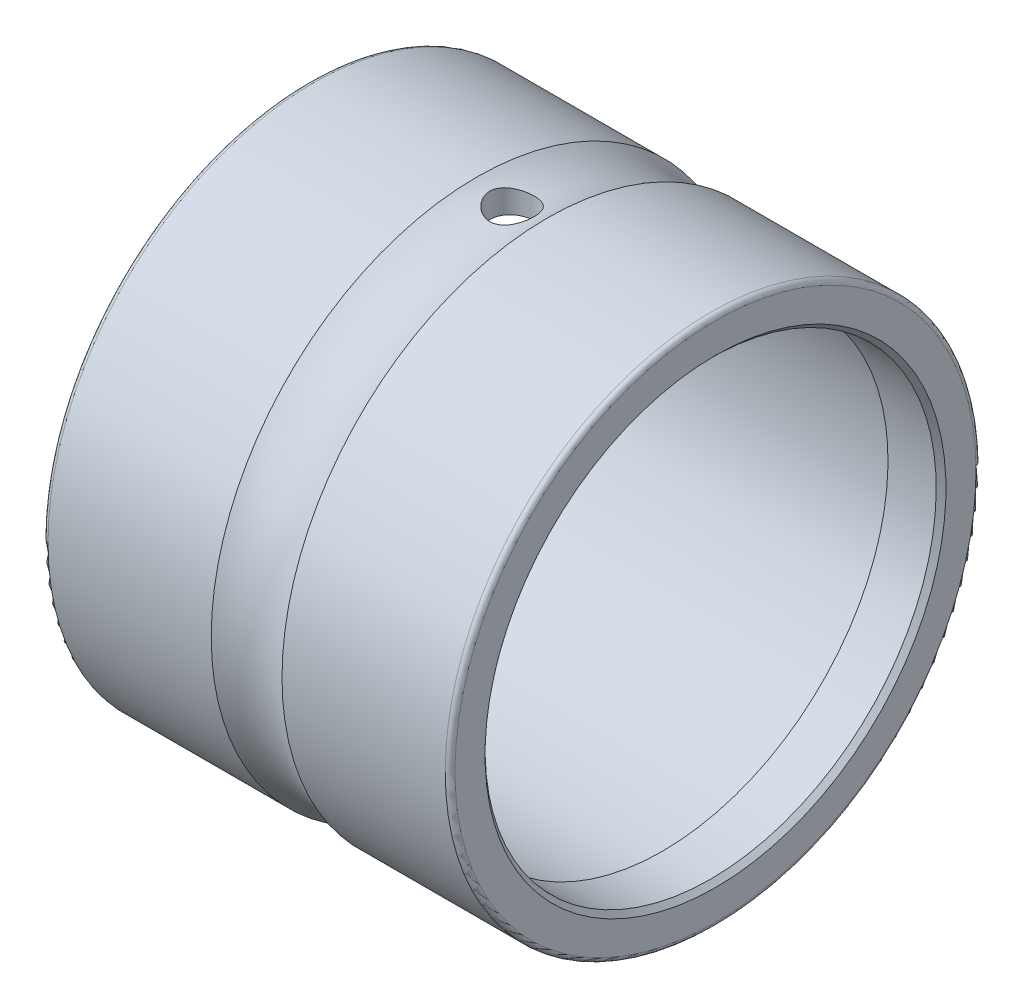
ISO-10303-21;
HEADER;
FILE_DESCRIPTION(('STEP AP214'),'2;1');
FILE_NAME('part.step','',(''),(''),'','','');
FILE_SCHEMA(('AUTOMOTIVE_DESIGN { 1 0 10303 214 1 1 1 1 }'));
ENDSEC;
DATA;
#1=APPLICATION_CONTEXT('core data for automotive mechanical design processes');
#2=APPLICATION_PROTOCOL_DEFINITION('international standard','automotive_design',2000,#1);
#3=PRODUCT_CONTEXT('',#1,'mechanical');
#4=PRODUCT('Part','Part','',(#3));
#5=PRODUCT_RELATED_PRODUCT_CATEGORY('part','',(#4));
#6=PRODUCT_DEFINITION_FORMATION('','',#4);
#7=PRODUCT_DEFINITION_CONTEXT('part definition',#1,'design');
#8=PRODUCT_DEFINITION('design','',#6,#7);
#9=PRODUCT_DEFINITION_SHAPE('','',#8);
#10=(LENGTH_UNIT() NAMED_UNIT(*) SI_UNIT(.MILLI.,.METRE.));
#11=(NAMED_UNIT(*) PLANE_ANGLE_UNIT() SI_UNIT($,.RADIAN.));
#12=(NAMED_UNIT(*) SI_UNIT($,.STERADIAN.) SOLID_ANGLE_UNIT());
#13=UNCERTAINTY_MEASURE_WITH_UNIT(LENGTH_MEASURE(1.E-05),#10,'distance_accuracy_value','');
#14=(GEOMETRIC_REPRESENTATION_CONTEXT(3) GLOBAL_UNCERTAINTY_ASSIGNED_CONTEXT((#13)) GLOBAL_UNIT_ASSIGNED_CONTEXT((#10,
#11,#12)) REPRESENTATION_CONTEXT('',''));
#15=CARTESIAN_POINT('',(0.,0.,0.));
#16=DIRECTION('',(0.,0.,1.));
#17=DIRECTION('',(1.,0.,0.));
#18=AXIS2_PLACEMENT_3D('',#15,#16,#17);
#19=CARTESIAN_POINT('',(0.,0.,0.));
#20=DIRECTION('',(-1.,0.,0.));
#21=DIRECTION('',(0.,-1.,0.));
#22=AXIS2_PLACEMENT_3D('',#19,#20,#21);
#23=TOROIDAL_SURFACE('',#22,18.75,4.24999999999999);
#24=CARTESIAN_POINT('',(-2.,0.,0.));
#25=DIRECTION('',(-1.,0.,0.));
#26=DIRECTION('',(0.,-1.,0.));
#27=AXIS2_PLACEMENT_3D('',#24,#25,#26);
#28=CIRCLE('',#27,15.);
#29=CARTESIAN_POINT('',(-2.,-15.,0.));
#30=VERTEX_POINT('',#29);
#31=EDGE_CURVE('E60',#30,#30,#28,.T.);
#32=ORIENTED_EDGE('',*,*,#31,.F.);
#33=EDGE_LOOP('',(#32));
#34=FACE_BOUND('',#33,.T.);
#35=CARTESIAN_POINT('',(2.,0.,0.));
#36=DIRECTION('',(-1.,0.,0.));
#37=DIRECTION('',(0.,-1.,0.));
#38=AXIS2_PLACEMENT_3D('',#35,#36,#37);
#39=CIRCLE('',#38,15.);
#40=CARTESIAN_POINT('',(2.,-15.,0.));
#41=VERTEX_POINT('',#40);
#42=EDGE_CURVE('E57',#41,#41,#39,.T.);
#43=ORIENTED_EDGE('',*,*,#42,.T.);
#44=EDGE_LOOP('',(#43));
#45=FACE_BOUND('',#44,.T.);
#46=CARTESIAN_POINT('',(-0.791048686627691,14.5420943867216,-0.967855190890034));
#47=CARTESIAN_POINT('',(-0.845709492811952,14.555444961997,-0.923180127931782));
#48=CARTESIAN_POINT('',(-0.89650687943695,14.5692724944397,-0.873930545180668));
#49=CARTESIAN_POINT('',(-0.989151270021171,14.5963724615478,-0.767499728587859));
#50=CARTESIAN_POINT('',(-1.03099916842709,14.6096449515795,-0.710319288329513));
#51=CARTESIAN_POINT('',(-1.10467476487462,14.6341669210217,-0.589256359267895));
#52=CARTESIAN_POINT('',(-1.1364824287829,14.6454123367091,-0.525360805458797));
#53=CARTESIAN_POINT('',(-1.18887078961419,14.6644744579728,-0.392643777702894));
#54=CARTESIAN_POINT('',(-1.20945636636744,14.6722926535568,-0.323824459564263));
#55=CARTESIAN_POINT('',(-1.2379813691787,14.6832508220583,-0.186133153750318));
#56=CARTESIAN_POINT('',(-1.24639359067287,14.6865653728875,-0.117373326334329));
#57=CARTESIAN_POINT('',(-1.25173469951536,14.6886612465337,0.0206518325937706));
#58=CARTESIAN_POINT('',(-1.2486666551591,14.6874437806093,0.0899170241000816));
#59=CARTESIAN_POINT('',(-1.23162452879759,14.6808078706484,0.22339863376863));
#60=CARTESIAN_POINT('',(-1.21819279081154,14.6755984219643,0.287696045622577));
#61=CARTESIAN_POINT('',(-1.18158385672168,14.6618276041373,0.413069280658407));
#62=CARTESIAN_POINT('',(-1.1584051914426,14.6532657296894,0.47414461660726));
#63=CARTESIAN_POINT('',(-1.10227276149858,14.6334296768686,0.593253383396846));
#64=CARTESIAN_POINT('',(-1.06906632234006,14.6220870190916,0.651155926213217));
#65=CARTESIAN_POINT('',(-0.99405167810642,14.5980005110734,0.76077329244967));
#66=CARTESIAN_POINT('',(-0.952240380158707,14.5852561577851,0.812485880394144));
#67=CARTESIAN_POINT('',(-0.858102781622751,14.5588105243837,0.911658787419354));
#68=CARTESIAN_POINT('',(-0.805280482163199,14.5450994788849,0.958646985588648));
#69=CARTESIAN_POINT('',(-0.692258271578246,14.5190006003608,1.04319658497374));
#70=CARTESIAN_POINT('',(-0.632057693796767,14.5066128870933,1.0807571334289));
#71=CARTESIAN_POINT('',(-0.505340621252411,14.4844748603913,1.14552345320767));
#72=CARTESIAN_POINT('',(-0.438785520034044,14.4747422622385,1.17266014245795));
#73=CARTESIAN_POINT('',(-0.301595801632724,14.4591993519161,1.21519150798326));
#74=CARTESIAN_POINT('',(-0.23096323705724,14.4533870846127,1.23059203777365));
#75=CARTESIAN_POINT('',(-0.0920110843501351,14.4466180077876,1.24846114789056));
#76=CARTESIAN_POINT('',(-0.0237931862674781,14.4454003944523,1.25162461453862));
#77=CARTESIAN_POINT('',(0.112182793396952,14.4472365369869,1.24681235243104));
#78=CARTESIAN_POINT('',(0.179940946782644,14.4502896096672,1.23883840534838));
#79=CARTESIAN_POINT('',(0.310823148669988,14.4601486377419,1.21251941368335));
#80=CARTESIAN_POINT('',(0.374026158189612,14.4668306254795,1.19451647394065));
#81=CARTESIAN_POINT('',(0.496504660349915,14.4831633993974,1.14902275013851));
#82=CARTESIAN_POINT('',(0.555779434466402,14.492814726896,1.12153023599354));
#83=CARTESIAN_POINT('',(0.671304179828376,14.5145618758131,1.05660485493537));
#84=CARTESIAN_POINT('',(0.727341445241536,14.5267393581201,1.01882149156785));
#85=CARTESIAN_POINT('',(0.832500615443431,14.5520540117515,0.93486547109749));
#86=CARTESIAN_POINT('',(0.881619880841958,14.565191546472,0.888689627359812));
#87=CARTESIAN_POINT('',(0.974390777463097,14.5918506377829,0.786194972913115));
#88=CARTESIAN_POINT('',(1.01758205464483,14.6053524875484,0.729452905266521));
#89=CARTESIAN_POINT('',(1.09385377917831,14.6304390031347,0.609142896248616));
#90=CARTESIAN_POINT('',(1.12693477895279,14.6420237736884,0.545575328077316));
#91=CARTESIAN_POINT('',(1.18162017670926,14.6617733975852,0.413890427588339));
#92=CARTESIAN_POINT('',(1.20333149328721,14.6699699531239,0.345822520698003));
#93=CARTESIAN_POINT('',(1.23486440821176,14.6820309840607,0.206627253130008));
#94=CARTESIAN_POINT('',(1.24469253234525,14.6858978370765,0.135501593895988));
#95=CARTESIAN_POINT('',(1.2517932720238,14.6886842637897,-0.00291584827152273));
#96=CARTESIAN_POINT('',(1.24982489217191,14.6879029332867,-0.0701636598327384));
#97=CARTESIAN_POINT('',(1.23517423485997,14.6821845878387,-0.203294451635884));
#98=CARTESIAN_POINT('',(1.222492342672,14.6772477223323,-0.269177480869907));
#99=CARTESIAN_POINT('',(1.18722559879251,14.6639262034601,-0.396600771168518));
#100=CARTESIAN_POINT('',(1.16481675242872,14.6556029852933,-0.458196620757425));
#101=CARTESIAN_POINT('',(1.11086825825009,14.6364125130759,-0.576819192446959));
#102=CARTESIAN_POINT('',(1.07932626937366,14.6255446068926,-0.633844738268994));
#103=CARTESIAN_POINT('',(1.00599124132089,14.6017107962678,-0.745090924576703));
#104=CARTESIAN_POINT('',(0.963730230467584,14.5886624334705,-0.79898535693295));
#105=CARTESIAN_POINT('',(0.871026035325545,14.5622998588632,-0.899151694913383));
#106=CARTESIAN_POINT('',(0.82058001216999,14.5489855562254,-0.945420944576796));
#107=CARTESIAN_POINT('',(0.710117710387622,14.5228579942504,-1.03118582903398));
#108=CARTESIAN_POINT('',(0.649765617419236,14.5100967775134,-1.07026673015902));
#109=CARTESIAN_POINT('',(0.522856217971381,14.48723935717,-1.13766398273923));
#110=CARTESIAN_POINT('',(0.45630043352799,14.477142502196,-1.16598296595091));
#111=CARTESIAN_POINT('',(0.320904639044563,14.461076001577,-1.21013929450276));
#112=CARTESIAN_POINT('',(0.252191748861617,14.454992362113,-1.22632335054963));
#113=CARTESIAN_POINT('',(0.112791842537128,14.4472216649406,-1.24689054688727));
#114=CARTESIAN_POINT('',(0.0421057709007099,14.4455325389795,-1.25127923863087));
#115=CARTESIAN_POINT('',(-0.0948324493527313,14.4467189203518,-1.24816797639638));
#116=CARTESIAN_POINT('',(-0.161103374533551,14.4493346637121,-1.24134461705635));
#117=CARTESIAN_POINT('',(-0.291480077495845,14.4583513560121,-1.21734776306887));
#118=CARTESIAN_POINT('',(-0.355585306144595,14.4647532574649,-1.20017166388151));
#119=CARTESIAN_POINT('',(-0.48576977699405,14.4814127880735,-1.15400754304184));
#120=CARTESIAN_POINT('',(-0.551471068915215,14.4919755163614,-1.12406346692639));
#121=CARTESIAN_POINT('',(-0.67645237672481,14.5155599461882,-1.0535967494691));
#122=CARTESIAN_POINT('',(-0.735729085601924,14.5285829047429,-1.01306869634622));
#123=CARTESIAN_POINT('',(-0.791048686627691,14.5420943867216,-0.967855190890034));
#124=B_SPLINE_CURVE_WITH_KNOTS('',3,(#46,#47,#48,#49,#50,#51,#52,#53,#54,#55,#56,#57,#58,#59,
#60,#61,#62,#63,#64,#65,#66,#67,#68,#69,#70,#71,#72,#73,#74,#75,#76,#77,#78,#79,#80,#81,#82,#83,
#84,#85,#86,#87,#88,#89,#90,#91,#92,#93,#94,#95,#96,#97,#98,#99,#100,#101,#102,#103,#104,#105,
#106,#107,#108,#109,#110,#111,#112,#113,#114,#115,#116,#117,#118,#119,#120,#121,#122,#123),
.UNSPECIFIED.,.T.,.F.,(4,2,2,2,2,2,2,2,2,2,2,2,2,2,2,2,2,2,2,2,2,2,2,2,2,2,2,2,2,2,2,2,2,2,2,2,
2,2,4),(0.,0.215285392788078,0.430549259049866,0.646239983371746,0.861836841429606,
1.06881205313994,1.27573195117241,1.47250203203844,1.66930178311845,1.87154567980613,
2.07386239703805,2.28890590773361,2.50396886278875,2.72043347724091,2.93679005722583,
3.14066314054157,3.34450361363285,3.54178252485215,3.73909742186039,3.94422525539414,
4.14943113954977,4.36613095724718,4.58281893240913,4.7974308607874,5.01192487903825,
5.21277273999089,5.41361337849623,5.61096221951837,5.80836169102162,6.01660586550603,
6.22492242182264,6.44292033546301,6.66086490478442,6.87231661809198,7.0836687948437,
7.28272880091213,7.48183890736625,7.69960744173425,7.91748754389677),.UNSPECIFIED.);
#125=CARTESIAN_POINT('',(-0.791048686627691,14.5420943867216,-0.967855190890034));
#126=VERTEX_POINT('',#125);
#127=EDGE_CURVE('E87',#126,#126,#124,.T.);
#128=ORIENTED_EDGE('',*,*,#127,.F.);
#129=EDGE_LOOP('',(#128));
#130=FACE_BOUND('',#129,.T.);
#131=ADVANCED_FACE('F32',(#34,#45,#130),#23,.F.);
#132=CARTESIAN_POINT('',(-11.5,0.,0.));
#133=DIRECTION('',(-1.,0.,0.));
#134=DIRECTION('',(0.,-1.,0.));
#135=AXIS2_PLACEMENT_3D('',#132,#133,#134);
#136=CYLINDRICAL_SURFACE('',#135,13.3);
#137=CARTESIAN_POINT('',(8.5,0.,0.));
#138=DIRECTION('',(-1.,0.,0.));
#139=DIRECTION('',(0.,-1.,0.));
#140=AXIS2_PLACEMENT_3D('',#137,#138,#139);
#141=CIRCLE('',#140,13.3);
#142=CARTESIAN_POINT('',(8.50000000000001,-13.3,0.));
#143=VERTEX_POINT('',#142);
#144=EDGE_CURVE('E81',#143,#143,#141,.T.);
#145=ORIENTED_EDGE('',*,*,#144,.F.);
#146=EDGE_LOOP('',(#145));
#147=FACE_BOUND('',#146,.T.);
#148=CARTESIAN_POINT('',(-8.5,0.,0.));
#149=DIRECTION('',(-1.,0.,0.));
#150=DIRECTION('',(0.,-1.,0.));
#151=AXIS2_PLACEMENT_3D('',#148,#149,#150);
#152=CIRCLE('',#151,13.3);
#153=CARTESIAN_POINT('',(-8.5,-13.3,0.));
#154=VERTEX_POINT('',#153);
#155=EDGE_CURVE('E78',#154,#154,#152,.T.);
#156=ORIENTED_EDGE('',*,*,#155,.T.);
#157=EDGE_LOOP('',(#156));
#158=FACE_BOUND('',#157,.T.);
#159=CARTESIAN_POINT('',(0.,13.2411291059335,-1.25));
#160=CARTESIAN_POINT('',(0.0700464875616936,13.241129880761,-1.24999695558279));
#161=CARTESIAN_POINT('',(0.140139814080811,13.2416909198872,-1.24409236611119));
#162=CARTESIAN_POINT('',(0.27838462201001,13.2438742566758,-1.2206261399049));
#163=CARTESIAN_POINT('',(0.346533852118931,13.2454977364398,-1.20305151844133));
#164=CARTESIAN_POINT('',(0.478868361186231,13.2496204707583,-1.15676016689976));
#165=CARTESIAN_POINT('',(0.543055957783782,13.252119207446,-1.12805002434548));
#166=CARTESIAN_POINT('',(0.665686738047254,13.2577102697086,-1.06031491210543));
#167=CARTESIAN_POINT('',(0.724131092494597,13.2608024739218,-1.02129205071496));
#168=CARTESIAN_POINT('',(0.8338194413777,13.2672432477429,-0.93390363581746));
#169=CARTESIAN_POINT('',(0.885042305384968,13.2705925271425,-0.885511609578806));
#170=CARTESIAN_POINT('',(0.978651839952098,13.2771636091312,-0.7808149288455));
#171=CARTESIAN_POINT('',(1.0210381132601,13.2803854059841,-0.724509918810449));
#172=CARTESIAN_POINT('',(1.09584340285647,13.286345430332,-0.605457247221609));
#173=CARTESIAN_POINT('',(1.1282438566043,13.2890827532715,-0.542697872984626));
#174=CARTESIAN_POINT('',(1.18203903517344,13.2937577089745,-0.412599441975766));
#175=CARTESIAN_POINT('',(1.20343399933923,13.2956953591289,-0.345260484835516));
#176=CARTESIAN_POINT('',(1.23454928134382,13.2985476736991,-0.208126872294224));
#177=CARTESIAN_POINT('',(1.244304136718,13.2994653638945,-0.138340117306385));
#178=CARTESIAN_POINT('',(1.25196912481923,13.3001846374932,0.00188571560428908));
#179=CARTESIAN_POINT('',(1.24987953153901,13.2999862467142,0.072324778399926));
#180=CARTESIAN_POINT('',(1.23394305348615,13.2984981955151,0.211621367749314));
#181=CARTESIAN_POINT('',(1.22013330737102,13.2972119822162,0.280483185177556));
#182=CARTESIAN_POINT('',(1.18120634699026,13.2936968427236,0.414907255076044));
#183=CARTESIAN_POINT('',(1.15608900065289,13.291467905519,0.480469468997276));
#184=CARTESIAN_POINT('',(1.09521885224493,13.2863120442857,0.606550753296654));
#185=CARTESIAN_POINT('',(1.05944954009537,13.2833840381379,0.667061806812835));
#186=CARTESIAN_POINT('',(0.978302806939817,13.2771587769151,0.781235597785615));
#187=CARTESIAN_POINT('',(0.932925137279506,13.273861512285,0.834898157952705));
#188=CARTESIAN_POINT('',(0.833640754892255,13.2672529153426,0.934069060703406));
#189=CARTESIAN_POINT('',(0.779701748659836,13.2639415779232,0.979545078680621));
#190=CARTESIAN_POINT('',(0.664938008092847,13.2576908007854,1.06080194406078));
#191=CARTESIAN_POINT('',(0.604113265579545,13.2547513615089,1.09658277994782));
#192=CARTESIAN_POINT('',(0.477280620912305,13.249576827286,1.15743302797081));
#193=CARTESIAN_POINT('',(0.411271813910051,13.2473418556433,1.18250056522204));
#194=CARTESIAN_POINT('',(0.275956509463604,13.2438318211917,1.22118769068166));
#195=CARTESIAN_POINT('',(0.206650100597272,13.2425567326146,1.23480758620532));
#196=CARTESIAN_POINT('',(0.0669903705380827,13.2411151998758,1.25017148094224));
#197=CARTESIAN_POINT('',(-0.00335794016612972,13.2409445393432,1.25196064685988));
#198=CARTESIAN_POINT('',(-0.143353414109117,13.2417200590399,1.24373079611318));
#199=CARTESIAN_POINT('',(-0.213000585688295,13.2426662259682,1.23371192007925));
#200=CARTESIAN_POINT('',(-0.349485859380247,13.2455649531119,1.20218812201591));
#201=CARTESIAN_POINT('',(-0.416328912555937,13.2475156511698,1.18070445027645));
#202=CARTESIAN_POINT('',(-0.545462217433947,13.2522021243806,1.12688256266221));
#203=CARTESIAN_POINT('',(-0.607752376661066,13.2549379154743,1.0945441263876));
#204=CARTESIAN_POINT('',(-0.726217887626157,13.2608965349498,1.01981709593409));
#205=CARTESIAN_POINT('',(-0.782374245553987,13.2641208062591,0.977398507499752));
#206=CARTESIAN_POINT('',(-0.886785716438103,13.2706883127451,0.883758396496077));
#207=CARTESIAN_POINT('',(-0.935040656587192,13.2740315505217,0.832536681449007));
#208=CARTESIAN_POINT('',(-1.02243466302311,13.2804729557228,0.722548660690846));
#209=CARTESIAN_POINT('',(-1.06154430975251,13.2835703116233,0.663758924746365));
#210=CARTESIAN_POINT('',(-1.12933532981737,13.2891591980988,0.540419801574072));
#211=CARTESIAN_POINT('',(-1.15801683144298,13.2916507361264,0.475870485214504));
#212=CARTESIAN_POINT('',(-1.20408729162508,13.295743568286,0.342948252177138));
#213=CARTESIAN_POINT('',(-1.22149418055557,13.2973462753674,0.274581595383412));
#214=CARTESIAN_POINT('',(-1.24457984859385,13.2994866398047,0.135880196709625));
#215=CARTESIAN_POINT('',(-1.25025891616863,13.3000243233568,0.0655455032801191));
#216=CARTESIAN_POINT('',(-1.24972394656146,13.2999740659617,-0.0748060714320061));
#217=CARTESIAN_POINT('',(-1.24355564752858,13.299390453905,-0.144823133115146));
#218=CARTESIAN_POINT('',(-1.21959674810243,13.2971717247736,-0.282821901811711));
#219=CARTESIAN_POINT('',(-1.20180613581198,13.2955366066226,-0.35080360674157));
#220=CARTESIAN_POINT('',(-1.15511990569329,13.2913981614993,-0.482802796116659));
#221=CARTESIAN_POINT('',(-1.12622543526919,13.2888949242356,-0.546820689364344));
#222=CARTESIAN_POINT('',(-1.05815667936196,13.2832996638098,-0.669104792430403));
#223=CARTESIAN_POINT('',(-1.01898249286509,13.2802076463173,-0.72737105762537));
#224=CARTESIAN_POINT('',(-0.931294608646798,13.2737672121853,-0.836732294299455));
#225=CARTESIAN_POINT('',(-0.882746906812363,13.2704178896062,-0.887799947586218));
#226=CARTESIAN_POINT('',(-0.777755472374156,13.2638480349448,-0.981085241146698));
#227=CARTESIAN_POINT('',(-0.721309841378895,13.2606275340671,-1.02330074755391));
#228=CARTESIAN_POINT('',(-0.601986167690337,13.2546720554445,-1.09775740978167));
#229=CARTESIAN_POINT('',(-0.539093729567157,13.2519382032938,-1.12997556682845));
#230=CARTESIAN_POINT('',(-0.408807228679588,13.247279072571,-1.18335186175473));
#231=CARTESIAN_POINT('',(-0.34141837970543,13.245352875743,-1.2045225666658));
#232=CARTESIAN_POINT('',(-0.228034777636063,13.2430165922559,-1.22988054928662));
#233=CARTESIAN_POINT('',(-0.182766630855158,13.2423120962622,-1.23741514042305));
#234=CARTESIAN_POINT('',(-0.09167234307732,13.2413681003703,-1.24747585307889));
#235=CARTESIAN_POINT('',(-0.0458462040870984,13.2411285988003,-1.25000199260488));
#236=CARTESIAN_POINT('',(0.,13.2411291059335,-1.25));
#237=B_SPLINE_CURVE_WITH_KNOTS('',3,(#159,#160,#161,#162,#163,#164,#165,#166,#167,#168,#169,
#170,#171,#172,#173,#174,#175,#176,#177,#178,#179,#180,#181,#182,#183,#184,#185,#186,#187,#188,
#189,#190,#191,#192,#193,#194,#195,#196,#197,#198,#199,#200,#201,#202,#203,#204,#205,#206,#207,
#208,#209,#210,#211,#212,#213,#214,#215,#216,#217,#218,#219,#220,#221,#222,#223,#224,#225,#226,
#227,#228,#229,#230,#231,#232,#233,#234,#235,#236),.UNSPECIFIED.,.T.,.F.,(4,2,2,2,2,2,2,2,2,2,2,
2,2,2,2,2,2,2,2,2,2,2,2,2,2,2,2,2,2,2,2,2,2,2,2,2,2,2,4),(0.,0.209972051775691,
0.420178122521907,0.630260029289283,0.840299020843774,1.05094037820343,1.26159120297411,
1.47263127501402,1.68366675721589,1.8940745035012,2.10447738253097,2.31421601856286,
2.52395710438658,2.73402498684577,2.94409830630816,3.1549837290912,3.36586940236209,
3.57679196665917,3.78770886849786,3.99782007623863,4.2079287816404,4.41764939101857,
4.62737425891219,4.83773117048573,5.0480926820355,5.25912187299004,5.47014846771263,
5.68083863074191,5.89152361140343,6.10139685260453,6.31127030864259,6.52112208348268,
6.73097183767576,6.94159766995257,7.15227421671072,7.363431889299,7.5743488329066,
7.71177836696104,7.84920740692277),.UNSPECIFIED.);
#238=CARTESIAN_POINT('',(0.,13.2411291059335,-1.25));
#239=VERTEX_POINT('',#238);
#240=EDGE_CURVE('E36',#239,#239,#237,.T.);
#241=ORIENTED_EDGE('',*,*,#240,.F.);
#242=EDGE_LOOP('',(#241));
#243=FACE_BOUND('',#242,.T.);
#244=ADVANCED_FACE('F106',(#147,#158,#243),#136,.F.);
#245=CARTESIAN_POINT('',(-11.5,0.,0.));
#246=DIRECTION('',(-1.,0.,0.));
#247=DIRECTION('',(0.,-1.,0.));
#248=AXIS2_PLACEMENT_3D('',#245,#246,#247);
#249=CYLINDRICAL_SURFACE('',#248,12.75);
#250=CARTESIAN_POINT('',(11.225,0.,0.));
#251=DIRECTION('',(-1.,0.,0.));
#252=DIRECTION('',(0.,-1.,0.));
#253=AXIS2_PLACEMENT_3D('',#250,#251,#252);
#254=CIRCLE('',#253,12.75);
#255=CARTESIAN_POINT('',(11.225,-12.75,0.));
#256=VERTEX_POINT('',#255);
#257=EDGE_CURVE('E10',#256,#256,#254,.T.);
#258=ORIENTED_EDGE('',*,*,#257,.F.);
#259=EDGE_LOOP('',(#258));
#260=FACE_BOUND('',#259,.T.);
#261=CARTESIAN_POINT('',(8.5,0.,0.));
#262=DIRECTION('',(-1.,0.,0.));
#263=DIRECTION('',(0.,-1.,0.));
#264=AXIS2_PLACEMENT_3D('',#261,#262,#263);
#265=CIRCLE('',#264,12.75);
#266=CARTESIAN_POINT('',(8.50000000000001,-12.75,0.));
#267=VERTEX_POINT('',#266);
#268=EDGE_CURVE('E84',#267,#267,#265,.T.);
#269=ORIENTED_EDGE('',*,*,#268,.T.);
#270=EDGE_LOOP('',(#269));
#271=FACE_BOUND('',#270,.T.);
#272=ADVANCED_FACE('F34',(#260,#271),#249,.F.);
#273=CARTESIAN_POINT('',(11.225,0.,0.));
#274=DIRECTION('',(1.,0.,0.));
#275=DIRECTION('',(0.,1.,0.));
#276=AXIS2_PLACEMENT_3D('',#273,#274,#275);
#277=CONICAL_SURFACE('',#276,12.75,0.785398163397451);
#278=CARTESIAN_POINT('',(11.5,0.,0.));
#279=DIRECTION('',(-1.,0.,0.));
#280=DIRECTION('',(0.,-1.,0.));
#281=AXIS2_PLACEMENT_3D('',#278,#279,#280);
#282=CIRCLE('',#281,13.025);
#283=CARTESIAN_POINT('',(11.5,-13.025,0.));
#284=VERTEX_POINT('',#283);
#285=EDGE_CURVE('E45',#284,#284,#282,.T.);
#286=ORIENTED_EDGE('',*,*,#285,.F.);
#287=EDGE_LOOP('',(#286));
#288=FACE_BOUND('',#287,.T.);
#289=ORIENTED_EDGE('',*,*,#257,.T.);
#290=EDGE_LOOP('',(#289));
#291=FACE_BOUND('',#290,.T.);
#292=ADVANCED_FACE('F161',(#288,#291),#277,.F.);
#293=CARTESIAN_POINT('',(11.5,13.025,0.));
#294=DIRECTION('',(-1.,0.,0.));
#295=DIRECTION('',(0.,-1.,0.));
#296=AXIS2_PLACEMENT_3D('',#293,#294,#295);
#297=PLANE('',#296);
#298=CARTESIAN_POINT('',(11.5,0.,0.));
#299=DIRECTION('',(-1.,0.,0.));
#300=DIRECTION('',(0.,-1.,0.));
#301=AXIS2_PLACEMENT_3D('',#298,#299,#300);
#302=CIRCLE('',#301,14.725);
#303=CARTESIAN_POINT('',(11.5,-14.725,0.));
#304=VERTEX_POINT('',#303);
#305=EDGE_CURVE('E49',#304,#304,#302,.T.);
#306=ORIENTED_EDGE('',*,*,#305,.F.);
#307=EDGE_LOOP('',(#306));
#308=FACE_BOUND('',#307,.T.);
#309=ORIENTED_EDGE('',*,*,#285,.T.);
#310=EDGE_LOOP('',(#309));
#311=FACE_BOUND('',#310,.T.);
#312=ADVANCED_FACE('F155',(#308,#311),#297,.F.);
#313=CARTESIAN_POINT('',(11.225,0.,0.));
#314=DIRECTION('',(-1.,0.,0.));
#315=DIRECTION('',(0.,-1.,0.));
#316=AXIS2_PLACEMENT_3D('',#313,#314,#315);
#317=TOROIDAL_SURFACE('',#316,14.725,0.274999999999999);
#318=CARTESIAN_POINT('',(11.225,0.,0.));
#319=DIRECTION('',(-1.,0.,0.));
#320=DIRECTION('',(0.,-1.,0.));
#321=AXIS2_PLACEMENT_3D('',#318,#319,#320);
#322=CIRCLE('',#321,15.);
#323=CARTESIAN_POINT('',(11.225,-15.,0.));
#324=VERTEX_POINT('',#323);
#325=EDGE_CURVE('E54',#324,#324,#322,.T.);
#326=ORIENTED_EDGE('',*,*,#325,.F.);
#327=EDGE_LOOP('',(#326));
#328=FACE_BOUND('',#327,.T.);
#329=ORIENTED_EDGE('',*,*,#305,.T.);
#330=EDGE_LOOP('',(#329));
#331=FACE_BOUND('',#330,.T.);
#332=ADVANCED_FACE('F136',(#328,#331),#317,.T.);
#333=CARTESIAN_POINT('',(-11.5,0.,0.));
#334=DIRECTION('',(-1.,0.,0.));
#335=DIRECTION('',(0.,-1.,0.));
#336=AXIS2_PLACEMENT_3D('',#333,#334,#335);
#337=CYLINDRICAL_SURFACE('',#336,15.);
#338=ORIENTED_EDGE('',*,*,#42,.F.);
#339=EDGE_LOOP('',(#338));
#340=FACE_BOUND('',#339,.T.);
#341=ORIENTED_EDGE('',*,*,#325,.T.);
#342=EDGE_LOOP('',(#341));
#343=FACE_BOUND('',#342,.T.);
#344=ADVANCED_FACE('F131',(#340,#343),#337,.T.);
#345=CARTESIAN_POINT('',(-11.5,0.,0.));
#346=DIRECTION('',(-1.,0.,0.));
#347=DIRECTION('',(0.,-1.,0.));
#348=AXIS2_PLACEMENT_3D('',#345,#346,#347);
#349=CYLINDRICAL_SURFACE('',#348,15.);
#350=CARTESIAN_POINT('',(-11.225,0.,0.));
#351=DIRECTION('',(-1.,0.,0.));
#352=DIRECTION('',(0.,-1.,0.));
#353=AXIS2_PLACEMENT_3D('',#350,#351,#352);
#354=CIRCLE('',#353,15.);
#355=CARTESIAN_POINT('',(-11.225,-15.,0.));
#356=VERTEX_POINT('',#355);
#357=EDGE_CURVE('E63',#356,#356,#354,.T.);
#358=ORIENTED_EDGE('',*,*,#357,.F.);
#359=EDGE_LOOP('',(#358));
#360=FACE_BOUND('',#359,.T.);
#361=ORIENTED_EDGE('',*,*,#31,.T.);
#362=EDGE_LOOP('',(#361));
#363=FACE_BOUND('',#362,.T.);
#364=ADVANCED_FACE('F128',(#360,#363),#349,.T.);
#365=CARTESIAN_POINT('',(-11.225,0.,0.));
#366=DIRECTION('',(-1.,0.,0.));
#367=DIRECTION('',(0.,-1.,0.));
#368=AXIS2_PLACEMENT_3D('',#365,#366,#367);
#369=TOROIDAL_SURFACE('',#368,14.725,0.274999999999999);
#370=CARTESIAN_POINT('',(-11.5,0.,0.));
#371=DIRECTION('',(-1.,0.,0.));
#372=DIRECTION('',(0.,-1.,0.));
#373=AXIS2_PLACEMENT_3D('',#370,#371,#372);
#374=CIRCLE('',#373,14.725);
#375=CARTESIAN_POINT('',(-11.5,-14.725,0.));
#376=VERTEX_POINT('',#375);
#377=EDGE_CURVE('E66',#376,#376,#374,.T.);
#378=ORIENTED_EDGE('',*,*,#377,.F.);
#379=EDGE_LOOP('',(#378));
#380=FACE_BOUND('',#379,.T.);
#381=ORIENTED_EDGE('',*,*,#357,.T.);
#382=EDGE_LOOP('',(#381));
#383=FACE_BOUND('',#382,.T.);
#384=ADVANCED_FACE('F125',(#380,#383),#369,.T.);
#385=CARTESIAN_POINT('',(-11.5,13.025,0.));
#386=DIRECTION('',(1.,0.,0.));
#387=DIRECTION('',(0.,1.,0.));
#388=AXIS2_PLACEMENT_3D('',#385,#386,#387);
#389=PLANE('',#388);
#390=CARTESIAN_POINT('',(-11.5,0.,0.));
#391=DIRECTION('',(-1.,0.,0.));
#392=DIRECTION('',(0.,-1.,0.));
#393=AXIS2_PLACEMENT_3D('',#390,#391,#392);
#394=CIRCLE('',#393,13.025);
#395=CARTESIAN_POINT('',(-11.5,-13.025,0.));
#396=VERTEX_POINT('',#395);
#397=EDGE_CURVE('E69',#396,#396,#394,.T.);
#398=ORIENTED_EDGE('',*,*,#397,.F.);
#399=EDGE_LOOP('',(#398));
#400=FACE_BOUND('',#399,.T.);
#401=ORIENTED_EDGE('',*,*,#377,.T.);
#402=EDGE_LOOP('',(#401));
#403=FACE_BOUND('',#402,.T.);
#404=ADVANCED_FACE('F121',(#400,#403),#389,.F.);
#405=CARTESIAN_POINT('',(-11.5,0.,0.));
#406=DIRECTION('',(-1.,0.,0.));
#407=DIRECTION('',(0.,-1.,0.));
#408=AXIS2_PLACEMENT_3D('',#405,#406,#407);
#409=CONICAL_SURFACE('',#408,13.025,0.785398163397448);
#410=CARTESIAN_POINT('',(-11.225,0.,0.));
#411=DIRECTION('',(-1.,0.,0.));
#412=DIRECTION('',(0.,-1.,0.));
#413=AXIS2_PLACEMENT_3D('',#410,#411,#412);
#414=CIRCLE('',#413,12.75);
#415=CARTESIAN_POINT('',(-11.225,-12.75,0.));
#416=VERTEX_POINT('',#415);
#417=EDGE_CURVE('E72',#416,#416,#414,.T.);
#418=ORIENTED_EDGE('',*,*,#417,.F.);
#419=EDGE_LOOP('',(#418));
#420=FACE_BOUND('',#419,.T.);
#421=ORIENTED_EDGE('',*,*,#397,.T.);
#422=EDGE_LOOP('',(#421));
#423=FACE_BOUND('',#422,.T.);
#424=ADVANCED_FACE('F117',(#420,#423),#409,.F.);
#425=CARTESIAN_POINT('',(-11.5,0.,0.));
#426=DIRECTION('',(-1.,0.,0.));
#427=DIRECTION('',(0.,-1.,0.));
#428=AXIS2_PLACEMENT_3D('',#425,#426,#427);
#429=CYLINDRICAL_SURFACE('',#428,12.75);
#430=CARTESIAN_POINT('',(-8.5,0.,0.));
#431=DIRECTION('',(-1.,0.,0.));
#432=DIRECTION('',(0.,-1.,0.));
#433=AXIS2_PLACEMENT_3D('',#430,#431,#432);
#434=CIRCLE('',#433,12.75);
#435=CARTESIAN_POINT('',(-8.5,-12.75,0.));
#436=VERTEX_POINT('',#435);
#437=EDGE_CURVE('E75',#436,#436,#434,.T.);
#438=ORIENTED_EDGE('',*,*,#437,.F.);
#439=EDGE_LOOP('',(#438));
#440=FACE_BOUND('',#439,.T.);
#441=ORIENTED_EDGE('',*,*,#417,.T.);
#442=EDGE_LOOP('',(#441));
#443=FACE_BOUND('',#442,.T.);
#444=ADVANCED_FACE('F113',(#440,#443),#429,.F.);
#445=CARTESIAN_POINT('',(-8.5,13.3,0.));
#446=DIRECTION('',(-1.,0.,0.));
#447=DIRECTION('',(0.,-1.,0.));
#448=AXIS2_PLACEMENT_3D('',#445,#446,#447);
#449=PLANE('',#448);
#450=ORIENTED_EDGE('',*,*,#155,.F.);
#451=EDGE_LOOP('',(#450));
#452=FACE_BOUND('',#451,.T.);
#453=ORIENTED_EDGE('',*,*,#437,.T.);
#454=EDGE_LOOP('',(#453));
#455=FACE_BOUND('',#454,.T.);
#456=ADVANCED_FACE('F104',(#452,#455),#449,.F.);
#457=CARTESIAN_POINT('',(8.5,13.3,0.));
#458=DIRECTION('',(1.,0.,0.));
#459=DIRECTION('',(0.,1.,0.));
#460=AXIS2_PLACEMENT_3D('',#457,#458,#459);
#461=PLANE('',#460);
#462=ORIENTED_EDGE('',*,*,#268,.F.);
#463=EDGE_LOOP('',(#462));
#464=FACE_BOUND('',#463,.T.);
#465=ORIENTED_EDGE('',*,*,#144,.T.);
#466=EDGE_LOOP('',(#465));
#467=FACE_BOUND('',#466,.T.);
#468=ADVANCED_FACE('F100',(#464,#467),#461,.F.);
#469=CARTESIAN_POINT('',(0.,15.,0.));
#470=DIRECTION('',(0.,-1.,0.));
#471=DIRECTION('',(0.,0.,-1.));
#472=AXIS2_PLACEMENT_3D('',#469,#470,#471);
#473=CYLINDRICAL_SURFACE('',#472,1.25);
#474=ORIENTED_EDGE('',*,*,#240,.T.);
#475=EDGE_LOOP('',(#474));
#476=FACE_BOUND('',#475,.T.);
#477=ORIENTED_EDGE('',*,*,#127,.T.);
#478=EDGE_LOOP('',(#477));
#479=FACE_BOUND('',#478,.T.);
#480=ADVANCED_FACE('F96',(#476,#479),#473,.F.);
#481=CLOSED_SHELL('',(#131,#244,#272,#292,#312,#332,#344,#364,#384,#404,#424,#444,#456,#468,#480));
#482=MANIFOLD_SOLID_BREP('B2',#481);
#483=ADVANCED_BREP_SHAPE_REPRESENTATION('',(#18,#482),#14);
#484=SHAPE_DEFINITION_REPRESENTATION(#9,#483);
ENDSEC;
END-ISO-10303-21;
